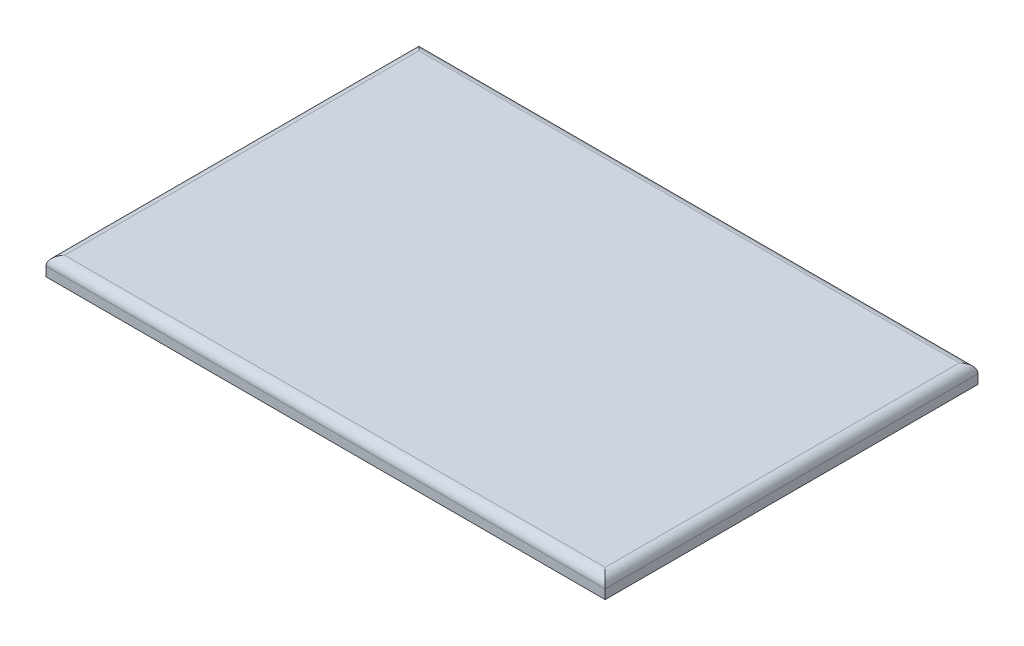
ISO-10303-21;
HEADER;
FILE_DESCRIPTION(('STEP AP214'),'2;1');
FILE_NAME('part.step','',(''),(''),'','','');
FILE_SCHEMA(('AUTOMOTIVE_DESIGN { 1 0 10303 214 1 1 1 1 }'));
ENDSEC;
DATA;
#1=APPLICATION_CONTEXT('core data for automotive mechanical design processes');
#2=APPLICATION_PROTOCOL_DEFINITION('international standard','automotive_design',2000,#1);
#3=PRODUCT_CONTEXT('',#1,'mechanical');
#4=PRODUCT('Part','Part','',(#3));
#5=PRODUCT_RELATED_PRODUCT_CATEGORY('part','',(#4));
#6=PRODUCT_DEFINITION_FORMATION('','',#4);
#7=PRODUCT_DEFINITION_CONTEXT('part definition',#1,'design');
#8=PRODUCT_DEFINITION('design','',#6,#7);
#9=PRODUCT_DEFINITION_SHAPE('','',#8);
#10=(LENGTH_UNIT() NAMED_UNIT(*) SI_UNIT(.MILLI.,.METRE.));
#11=(NAMED_UNIT(*) PLANE_ANGLE_UNIT() SI_UNIT($,.RADIAN.));
#12=(NAMED_UNIT(*) SI_UNIT($,.STERADIAN.) SOLID_ANGLE_UNIT());
#13=UNCERTAINTY_MEASURE_WITH_UNIT(LENGTH_MEASURE(1.E-05),#10,'distance_accuracy_value','');
#14=(GEOMETRIC_REPRESENTATION_CONTEXT(3) GLOBAL_UNCERTAINTY_ASSIGNED_CONTEXT((#13)) GLOBAL_UNIT_ASSIGNED_CONTEXT((#10,
#11,#12)) REPRESENTATION_CONTEXT('',''));
#15=CARTESIAN_POINT('',(0.,0.,0.));
#16=DIRECTION('',(0.,0.,1.));
#17=DIRECTION('',(1.,0.,0.));
#18=AXIS2_PLACEMENT_3D('',#15,#16,#17);
#19=CARTESIAN_POINT('',(30.,2.,-20.));
#20=DIRECTION('',(-1.,0.,0.));
#21=DIRECTION('',(0.,0.,1.));
#22=AXIS2_PLACEMENT_3D('',#19,#20,#21);
#23=PLANE('',#22);
#24=DIRECTION('',(0.,-1.,0.));
#25=VECTOR('',#24,1.);
#26=CARTESIAN_POINT('',(30.,2.,-20.));
#27=LINE('',#26,#25);
#28=CARTESIAN_POINT('',(30.,1.,-20.));
#29=VERTEX_POINT('',#28);
#30=CARTESIAN_POINT('',(30.,0.,-20.));
#31=VERTEX_POINT('',#30);
#32=EDGE_CURVE('E207',#29,#31,#27,.T.);
#33=ORIENTED_EDGE('',*,*,#32,.F.);
#34=DIRECTION('',(0.,0.,-1.));
#35=VECTOR('',#34,1.);
#36=CARTESIAN_POINT('',(30.,1.,20.));
#37=LINE('',#36,#35);
#38=CARTESIAN_POINT('',(30.,1.,20.));
#39=VERTEX_POINT('',#38);
#40=EDGE_CURVE('E233',#29,#39,#37,.F.);
#41=ORIENTED_EDGE('',*,*,#40,.T.);
#42=DIRECTION('',(0.,-1.,0.));
#43=VECTOR('',#42,1.);
#44=CARTESIAN_POINT('',(30.,2.,20.));
#45=LINE('',#44,#43);
#46=CARTESIAN_POINT('',(30.,0.,20.));
#47=VERTEX_POINT('',#46);
#48=EDGE_CURVE('E198',#39,#47,#45,.T.);
#49=ORIENTED_EDGE('',*,*,#48,.T.);
#50=DIRECTION('',(0.,0.,-1.));
#51=VECTOR('',#50,1.);
#52=CARTESIAN_POINT('',(30.,0.,-20.));
#53=LINE('',#52,#51);
#54=EDGE_CURVE('E177',#47,#31,#53,.T.);
#55=ORIENTED_EDGE('',*,*,#54,.T.);
#56=EDGE_LOOP('',(#33,#41,#49,#55));
#57=FACE_BOUND('',#56,.T.);
#58=ADVANCED_FACE('F45',(#57),#23,.F.);
#59=CARTESIAN_POINT('',(-30.,2.,-20.));
#60=DIRECTION('',(0.,0.,1.));
#61=DIRECTION('',(1.,0.,0.));
#62=AXIS2_PLACEMENT_3D('',#59,#60,#61);
#63=PLANE('',#62);
#64=DIRECTION('',(0.,-1.,0.));
#65=VECTOR('',#64,1.);
#66=CARTESIAN_POINT('',(-30.,2.,-20.));
#67=LINE('',#66,#65);
#68=CARTESIAN_POINT('',(-30.,1.,-20.));
#69=VERTEX_POINT('',#68);
#70=CARTESIAN_POINT('',(-30.,0.,-20.));
#71=VERTEX_POINT('',#70);
#72=EDGE_CURVE('E204',#69,#71,#67,.T.);
#73=ORIENTED_EDGE('',*,*,#72,.F.);
#74=DIRECTION('',(-1.,0.,0.));
#75=VECTOR('',#74,1.);
#76=CARTESIAN_POINT('',(30.,1.,-20.));
#77=LINE('',#76,#75);
#78=EDGE_CURVE('E230',#69,#29,#77,.F.);
#79=ORIENTED_EDGE('',*,*,#78,.T.);
#80=ORIENTED_EDGE('',*,*,#32,.T.);
#81=DIRECTION('',(-1.,0.,0.));
#82=VECTOR('',#81,1.);
#83=CARTESIAN_POINT('',(-30.,0.,-20.));
#84=LINE('',#83,#82);
#85=EDGE_CURVE('E186',#31,#71,#84,.T.);
#86=ORIENTED_EDGE('',*,*,#85,.T.);
#87=EDGE_LOOP('',(#73,#79,#80,#86));
#88=FACE_BOUND('',#87,.T.);
#89=ADVANCED_FACE('F304',(#88),#63,.F.);
#90=CARTESIAN_POINT('',(-30.,2.,-20.));
#91=DIRECTION('',(1.,0.,0.));
#92=DIRECTION('',(0.,0.,-1.));
#93=AXIS2_PLACEMENT_3D('',#90,#91,#92);
#94=PLANE('',#93);
#95=DIRECTION('',(0.,-1.,0.));
#96=VECTOR('',#95,1.);
#97=CARTESIAN_POINT('',(-30.,2.,20.));
#98=LINE('',#97,#96);
#99=CARTESIAN_POINT('',(-30.,1.,20.));
#100=VERTEX_POINT('',#99);
#101=CARTESIAN_POINT('',(-30.,0.,20.));
#102=VERTEX_POINT('',#101);
#103=EDGE_CURVE('E201',#100,#102,#98,.T.);
#104=ORIENTED_EDGE('',*,*,#103,.F.);
#105=DIRECTION('',(0.,0.,1.));
#106=VECTOR('',#105,1.);
#107=CARTESIAN_POINT('',(-30.,1.,-20.));
#108=LINE('',#107,#106);
#109=EDGE_CURVE('E227',#100,#69,#108,.F.);
#110=ORIENTED_EDGE('',*,*,#109,.T.);
#111=ORIENTED_EDGE('',*,*,#72,.T.);
#112=DIRECTION('',(0.,0.,1.));
#113=VECTOR('',#112,1.);
#114=CARTESIAN_POINT('',(-30.,0.,-20.));
#115=LINE('',#114,#113);
#116=EDGE_CURVE('E190',#71,#102,#115,.T.);
#117=ORIENTED_EDGE('',*,*,#116,.T.);
#118=EDGE_LOOP('',(#104,#110,#111,#117));
#119=FACE_BOUND('',#118,.T.);
#120=ADVANCED_FACE('F311',(#119),#94,.F.);
#121=CARTESIAN_POINT('',(-30.,2.,20.));
#122=DIRECTION('',(0.,0.,-1.));
#123=DIRECTION('',(-1.,0.,0.));
#124=AXIS2_PLACEMENT_3D('',#121,#122,#123);
#125=PLANE('',#124);
#126=ORIENTED_EDGE('',*,*,#48,.F.);
#127=DIRECTION('',(1.,0.,0.));
#128=VECTOR('',#127,1.);
#129=CARTESIAN_POINT('',(-30.,1.,20.));
#130=LINE('',#129,#128);
#131=EDGE_CURVE('E223',#39,#100,#130,.F.);
#132=ORIENTED_EDGE('',*,*,#131,.T.);
#133=ORIENTED_EDGE('',*,*,#103,.T.);
#134=DIRECTION('',(1.,0.,0.));
#135=VECTOR('',#134,1.);
#136=CARTESIAN_POINT('',(-30.,0.,20.));
#137=LINE('',#136,#135);
#138=EDGE_CURVE('E194',#102,#47,#137,.T.);
#139=ORIENTED_EDGE('',*,*,#138,.T.);
#140=EDGE_LOOP('',(#126,#132,#133,#139));
#141=FACE_BOUND('',#140,.T.);
#142=ADVANCED_FACE('F390',(#141),#125,.F.);
#143=CARTESIAN_POINT('',(0.,2.,0.));
#144=DIRECTION('',(0.,1.,0.));
#145=DIRECTION('',(0.,0.,1.));
#146=AXIS2_PLACEMENT_3D('',#143,#144,#145);
#147=PLANE('',#146);
#148=DIRECTION('',(0.,0.,1.));
#149=VECTOR('',#148,1.);
#150=CARTESIAN_POINT('',(-29.,2.,20.));
#151=LINE('',#150,#149);
#152=CARTESIAN_POINT('',(-29.,2.,-19.));
#153=VERTEX_POINT('',#152);
#154=CARTESIAN_POINT('',(-29.,2.,19.));
#155=VERTEX_POINT('',#154);
#156=EDGE_CURVE('E216',#153,#155,#151,.T.);
#157=ORIENTED_EDGE('',*,*,#156,.T.);
#158=DIRECTION('',(1.,0.,0.));
#159=VECTOR('',#158,1.);
#160=CARTESIAN_POINT('',(30.,2.,19.));
#161=LINE('',#160,#159);
#162=CARTESIAN_POINT('',(29.,2.,19.));
#163=VERTEX_POINT('',#162);
#164=EDGE_CURVE('E219',#155,#163,#161,.T.);
#165=ORIENTED_EDGE('',*,*,#164,.T.);
#166=DIRECTION('',(0.,0.,-1.));
#167=VECTOR('',#166,1.);
#168=CARTESIAN_POINT('',(29.,2.,-20.));
#169=LINE('',#168,#167);
#170=CARTESIAN_POINT('',(29.,2.,-19.));
#171=VERTEX_POINT('',#170);
#172=EDGE_CURVE('E210',#163,#171,#169,.T.);
#173=ORIENTED_EDGE('',*,*,#172,.T.);
#174=DIRECTION('',(-1.,0.,0.));
#175=VECTOR('',#174,1.);
#176=CARTESIAN_POINT('',(-30.,2.,-19.));
#177=LINE('',#176,#175);
#178=EDGE_CURVE('E213',#171,#153,#177,.T.);
#179=ORIENTED_EDGE('',*,*,#178,.T.);
#180=EDGE_LOOP('',(#157,#165,#173,#179));
#181=FACE_BOUND('',#180,.T.);
#182=ADVANCED_FACE('F381',(#181),#147,.T.);
#183=CARTESIAN_POINT('',(0.,0.,0.));
#184=DIRECTION('',(0.,1.,0.));
#185=DIRECTION('',(0.,0.,1.));
#186=AXIS2_PLACEMENT_3D('',#183,#184,#185);
#187=PLANE('',#186);
#188=DIRECTION('',(1.,0.,0.));
#189=VECTOR('',#188,1.);
#190=CARTESIAN_POINT('',(-28.5,0.,18.5));
#191=LINE('',#190,#189);
#192=CARTESIAN_POINT('',(-28.5,0.,18.5));
#193=VERTEX_POINT('',#192);
#194=CARTESIAN_POINT('',(28.5,0.,18.5));
#195=VERTEX_POINT('',#194);
#196=EDGE_CURVE('E148',#193,#195,#191,.T.);
#197=ORIENTED_EDGE('',*,*,#196,.T.);
#198=DIRECTION('',(0.,0.,-1.));
#199=VECTOR('',#198,1.);
#200=CARTESIAN_POINT('',(28.5,0.,-18.5));
#201=LINE('',#200,#199);
#202=CARTESIAN_POINT('',(28.5,0.,-18.5));
#203=VERTEX_POINT('',#202);
#204=EDGE_CURVE('E140',#195,#203,#201,.T.);
#205=ORIENTED_EDGE('',*,*,#204,.T.);
#206=DIRECTION('',(-1.,0.,0.));
#207=VECTOR('',#206,1.);
#208=CARTESIAN_POINT('',(-28.5,0.,-18.5));
#209=LINE('',#208,#207);
#210=CARTESIAN_POINT('',(-28.5,0.,-18.5));
#211=VERTEX_POINT('',#210);
#212=EDGE_CURVE('E151',#203,#211,#209,.T.);
#213=ORIENTED_EDGE('',*,*,#212,.T.);
#214=DIRECTION('',(0.,0.,1.));
#215=VECTOR('',#214,1.);
#216=CARTESIAN_POINT('',(-28.5,0.,-18.5));
#217=LINE('',#216,#215);
#218=EDGE_CURVE('E157',#211,#193,#217,.T.);
#219=ORIENTED_EDGE('',*,*,#218,.T.);
#220=EDGE_LOOP('',(#197,#205,#213,#219));
#221=FACE_BOUND('',#220,.T.);
#222=ORIENTED_EDGE('',*,*,#54,.F.);
#223=ORIENTED_EDGE('',*,*,#138,.F.);
#224=ORIENTED_EDGE('',*,*,#116,.F.);
#225=ORIENTED_EDGE('',*,*,#85,.F.);
#226=EDGE_LOOP('',(#222,#223,#224,#225));
#227=FACE_BOUND('',#226,.T.);
#228=ADVANCED_FACE('F159',(#221,#227),#187,.F.);
#229=CARTESIAN_POINT('',(28.5,-2.,-18.5));
#230=DIRECTION('',(1.,0.,0.));
#231=DIRECTION('',(0.,0.,-1.));
#232=AXIS2_PLACEMENT_3D('',#229,#230,#231);
#233=PLANE('',#232);
#234=DIRECTION('',(0.,1.,0.));
#235=VECTOR('',#234,1.);
#236=CARTESIAN_POINT('',(28.5,-2.,18.5));
#237=LINE('',#236,#235);
#238=CARTESIAN_POINT('',(28.5,-1.,18.5));
#239=VERTEX_POINT('',#238);
#240=EDGE_CURVE('E174',#239,#195,#237,.T.);
#241=ORIENTED_EDGE('',*,*,#240,.F.);
#242=DIRECTION('',(0.,0.,-1.));
#243=VECTOR('',#242,1.);
#244=CARTESIAN_POINT('',(28.5,-1.,-18.5));
#245=LINE('',#244,#243);
#246=CARTESIAN_POINT('',(28.5,-1.,-18.5));
#247=VERTEX_POINT('',#246);
#248=EDGE_CURVE('E11',#239,#247,#245,.T.);
#249=ORIENTED_EDGE('',*,*,#248,.T.);
#250=DIRECTION('',(0.,1.,0.));
#251=VECTOR('',#250,1.);
#252=CARTESIAN_POINT('',(28.5,-2.,-18.5));
#253=LINE('',#252,#251);
#254=EDGE_CURVE('E136',#247,#203,#253,.T.);
#255=ORIENTED_EDGE('',*,*,#254,.T.);
#256=ORIENTED_EDGE('',*,*,#204,.F.);
#257=EDGE_LOOP('',(#241,#249,#255,#256));
#258=FACE_BOUND('',#257,.T.);
#259=ADVANCED_FACE('F138',(#258),#233,.T.);
#260=CARTESIAN_POINT('',(-28.5,-2.,18.5));
#261=DIRECTION('',(0.,0.,1.));
#262=DIRECTION('',(1.,0.,0.));
#263=AXIS2_PLACEMENT_3D('',#260,#261,#262);
#264=PLANE('',#263);
#265=DIRECTION('',(0.,1.,0.));
#266=VECTOR('',#265,1.);
#267=CARTESIAN_POINT('',(-28.5,-2.,18.5));
#268=LINE('',#267,#266);
#269=CARTESIAN_POINT('',(-28.5,-1.,18.5));
#270=VERTEX_POINT('',#269);
#271=EDGE_CURVE('E178',#270,#193,#268,.T.);
#272=ORIENTED_EDGE('',*,*,#271,.F.);
#273=DIRECTION('',(1.,0.,0.));
#274=VECTOR('',#273,1.);
#275=CARTESIAN_POINT('',(28.5,-1.,18.5));
#276=LINE('',#275,#274);
#277=EDGE_CURVE('E55',#270,#239,#276,.T.);
#278=ORIENTED_EDGE('',*,*,#277,.T.);
#279=ORIENTED_EDGE('',*,*,#240,.T.);
#280=ORIENTED_EDGE('',*,*,#196,.F.);
#281=EDGE_LOOP('',(#272,#278,#279,#280));
#282=FACE_BOUND('',#281,.T.);
#283=ADVANCED_FACE('F293',(#282),#264,.T.);
#284=CARTESIAN_POINT('',(-28.5,-2.,-18.5));
#285=DIRECTION('',(-1.,0.,0.));
#286=DIRECTION('',(0.,0.,1.));
#287=AXIS2_PLACEMENT_3D('',#284,#285,#286);
#288=PLANE('',#287);
#289=DIRECTION('',(0.,1.,0.));
#290=VECTOR('',#289,1.);
#291=CARTESIAN_POINT('',(-28.5,-2.,-18.5));
#292=LINE('',#291,#290);
#293=CARTESIAN_POINT('',(-28.5,-1.,-18.5));
#294=VERTEX_POINT('',#293);
#295=EDGE_CURVE('E147',#294,#211,#292,.T.);
#296=ORIENTED_EDGE('',*,*,#295,.F.);
#297=DIRECTION('',(0.,0.,1.));
#298=VECTOR('',#297,1.);
#299=CARTESIAN_POINT('',(-28.5,-1.,18.5));
#300=LINE('',#299,#298);
#301=EDGE_CURVE('E70',#294,#270,#300,.T.);
#302=ORIENTED_EDGE('',*,*,#301,.T.);
#303=ORIENTED_EDGE('',*,*,#271,.T.);
#304=ORIENTED_EDGE('',*,*,#218,.F.);
#305=EDGE_LOOP('',(#296,#302,#303,#304));
#306=FACE_BOUND('',#305,.T.);
#307=ADVANCED_FACE('F292',(#306),#288,.T.);
#308=CARTESIAN_POINT('',(-28.5,-2.,-18.5));
#309=DIRECTION('',(0.,0.,-1.));
#310=DIRECTION('',(-1.,0.,0.));
#311=AXIS2_PLACEMENT_3D('',#308,#309,#310);
#312=PLANE('',#311);
#313=ORIENTED_EDGE('',*,*,#254,.F.);
#314=DIRECTION('',(-1.,0.,0.));
#315=VECTOR('',#314,1.);
#316=CARTESIAN_POINT('',(-28.5,-1.,-18.5));
#317=LINE('',#316,#315);
#318=EDGE_CURVE('E236',#247,#294,#317,.T.);
#319=ORIENTED_EDGE('',*,*,#318,.T.);
#320=ORIENTED_EDGE('',*,*,#295,.T.);
#321=ORIENTED_EDGE('',*,*,#212,.F.);
#322=EDGE_LOOP('',(#313,#319,#320,#321));
#323=FACE_BOUND('',#322,.T.);
#324=ADVANCED_FACE('F152',(#323),#312,.T.);
#325=CARTESIAN_POINT('',(0.,-2.,0.));
#326=DIRECTION('',(0.,1.,0.));
#327=DIRECTION('',(0.,0.,1.));
#328=AXIS2_PLACEMENT_3D('',#325,#326,#327);
#329=PLANE('',#328);
#330=DIRECTION('',(0.,0.,1.));
#331=VECTOR('',#330,1.);
#332=CARTESIAN_POINT('',(-27.5,-2.,-18.5));
#333=LINE('',#332,#331);
#334=CARTESIAN_POINT('',(-27.5,-2.,17.5));
#335=VERTEX_POINT('',#334);
#336=CARTESIAN_POINT('',(-27.5,-2.,-17.5));
#337=VERTEX_POINT('',#336);
#338=EDGE_CURVE('E254',#335,#337,#333,.F.);
#339=ORIENTED_EDGE('',*,*,#338,.T.);
#340=DIRECTION('',(-1.,0.,0.));
#341=VECTOR('',#340,1.);
#342=CARTESIAN_POINT('',(28.5,-2.,-17.5));
#343=LINE('',#342,#341);
#344=CARTESIAN_POINT('',(27.5,-2.,-17.5));
#345=VERTEX_POINT('',#344);
#346=EDGE_CURVE('E257',#337,#345,#343,.F.);
#347=ORIENTED_EDGE('',*,*,#346,.T.);
#348=DIRECTION('',(0.,0.,-1.));
#349=VECTOR('',#348,1.);
#350=CARTESIAN_POINT('',(27.5,-2.,18.5));
#351=LINE('',#350,#349);
#352=CARTESIAN_POINT('',(27.5,-2.,17.5));
#353=VERTEX_POINT('',#352);
#354=EDGE_CURVE('E248',#345,#353,#351,.F.);
#355=ORIENTED_EDGE('',*,*,#354,.T.);
#356=DIRECTION('',(1.,0.,0.));
#357=VECTOR('',#356,1.);
#358=CARTESIAN_POINT('',(-28.5,-2.,17.5));
#359=LINE('',#358,#357);
#360=EDGE_CURVE('E251',#353,#335,#359,.F.);
#361=ORIENTED_EDGE('',*,*,#360,.T.);
#362=EDGE_LOOP('',(#339,#347,#355,#361));
#363=FACE_BOUND('',#362,.T.);
#364=ADVANCED_FACE('F285',(#363),#329,.F.);
#365=CARTESIAN_POINT('',(0.,1.,-19.));
#366=DIRECTION('',(1.,0.,0.));
#367=DIRECTION('',(0.,0.,-1.));
#368=AXIS2_PLACEMENT_3D('',#365,#366,#367);
#369=CYLINDRICAL_SURFACE('',#368,1.);
#370=CARTESIAN_POINT('',(29.,1.,-19.));
#371=DIRECTION('',(0.707106781186548,0.,0.707106781186547));
#372=DIRECTION('',(-0.707106781186547,0.,0.707106781186548));
#373=AXIS2_PLACEMENT_3D('',#370,#371,#372);
#374=ELLIPSE('',#373,1.41421356237309,1.);
#375=EDGE_CURVE('E167',#29,#171,#374,.T.);
#376=ORIENTED_EDGE('',*,*,#375,.F.);
#377=ORIENTED_EDGE('',*,*,#78,.F.);
#378=CARTESIAN_POINT('',(-29.,1.,-19.));
#379=DIRECTION('',(0.707106781186547,0.,-0.707106781186548));
#380=DIRECTION('',(0.707106781186548,0.,0.707106781186547));
#381=AXIS2_PLACEMENT_3D('',#378,#379,#380);
#382=ELLIPSE('',#381,1.4142135623731,1.);
#383=EDGE_CURVE('E163',#153,#69,#382,.F.);
#384=ORIENTED_EDGE('',*,*,#383,.F.);
#385=ORIENTED_EDGE('',*,*,#178,.F.);
#386=EDGE_LOOP('',(#376,#377,#384,#385));
#387=FACE_BOUND('',#386,.T.);
#388=ADVANCED_FACE('F328',(#387),#369,.T.);
#389=CARTESIAN_POINT('',(-29.,1.,0.));
#390=DIRECTION('',(0.,0.,-1.));
#391=DIRECTION('',(-1.,0.,0.));
#392=AXIS2_PLACEMENT_3D('',#389,#390,#391);
#393=CYLINDRICAL_SURFACE('',#392,1.);
#394=ORIENTED_EDGE('',*,*,#383,.T.);
#395=ORIENTED_EDGE('',*,*,#109,.F.);
#396=CARTESIAN_POINT('',(-29.,1.,19.));
#397=DIRECTION('',(-0.707106781186548,0.,-0.707106781186547));
#398=DIRECTION('',(0.707106781186547,0.,-0.707106781186548));
#399=AXIS2_PLACEMENT_3D('',#396,#397,#398);
#400=ELLIPSE('',#399,1.41421356237309,1.);
#401=EDGE_CURVE('E240',#155,#100,#400,.F.);
#402=ORIENTED_EDGE('',*,*,#401,.F.);
#403=ORIENTED_EDGE('',*,*,#156,.F.);
#404=EDGE_LOOP('',(#394,#395,#402,#403));
#405=FACE_BOUND('',#404,.T.);
#406=ADVANCED_FACE('F324',(#405),#393,.T.);
#407=CARTESIAN_POINT('',(29.,1.,0.));
#408=DIRECTION('',(0.,0.,1.));
#409=DIRECTION('',(1.,0.,0.));
#410=AXIS2_PLACEMENT_3D('',#407,#408,#409);
#411=CYLINDRICAL_SURFACE('',#410,1.);
#412=ORIENTED_EDGE('',*,*,#375,.T.);
#413=ORIENTED_EDGE('',*,*,#172,.F.);
#414=CARTESIAN_POINT('',(29.,1.,19.));
#415=DIRECTION('',(-0.707106781186547,0.,0.707106781186548));
#416=DIRECTION('',(0.707106781186548,0.,0.707106781186547));
#417=AXIS2_PLACEMENT_3D('',#414,#415,#416);
#418=ELLIPSE('',#417,1.4142135623731,1.);
#419=EDGE_CURVE('E237',#39,#163,#418,.T.);
#420=ORIENTED_EDGE('',*,*,#419,.F.);
#421=ORIENTED_EDGE('',*,*,#40,.F.);
#422=EDGE_LOOP('',(#412,#413,#420,#421));
#423=FACE_BOUND('',#422,.T.);
#424=ADVANCED_FACE('F320',(#423),#411,.T.);
#425=CARTESIAN_POINT('',(0.,1.,19.));
#426=DIRECTION('',(-1.,0.,0.));
#427=DIRECTION('',(0.,0.,1.));
#428=AXIS2_PLACEMENT_3D('',#425,#426,#427);
#429=CYLINDRICAL_SURFACE('',#428,1.);
#430=ORIENTED_EDGE('',*,*,#401,.T.);
#431=ORIENTED_EDGE('',*,*,#131,.F.);
#432=ORIENTED_EDGE('',*,*,#419,.T.);
#433=ORIENTED_EDGE('',*,*,#164,.F.);
#434=EDGE_LOOP('',(#430,#431,#432,#433));
#435=FACE_BOUND('',#434,.T.);
#436=ADVANCED_FACE('F317',(#435),#429,.T.);
#437=CARTESIAN_POINT('',(-28.5,-1.,17.5));
#438=DIRECTION('',(-1.,0.,0.));
#439=DIRECTION('',(0.,0.,1.));
#440=AXIS2_PLACEMENT_3D('',#437,#438,#439);
#441=CYLINDRICAL_SURFACE('',#440,1.);
#442=CARTESIAN_POINT('',(-27.5,-1.,17.5));
#443=DIRECTION('',(-0.707106781186547,0.,-0.707106781186547));
#444=DIRECTION('',(-0.707106781186547,0.,0.707106781186548));
#445=AXIS2_PLACEMENT_3D('',#442,#443,#444);
#446=ELLIPSE('',#445,1.41421356237309,1.);
#447=EDGE_CURVE('E270',#335,#270,#446,.T.);
#448=ORIENTED_EDGE('',*,*,#447,.F.);
#449=ORIENTED_EDGE('',*,*,#360,.F.);
#450=CARTESIAN_POINT('',(27.5,-1.,17.5));
#451=DIRECTION('',(-0.707106781186547,0.,0.707106781186548));
#452=DIRECTION('',(0.707106781186547,0.,0.707106781186547));
#453=AXIS2_PLACEMENT_3D('',#450,#451,#452);
#454=ELLIPSE('',#453,1.4142135623731,1.);
#455=EDGE_CURVE('E49',#239,#353,#454,.F.);
#456=ORIENTED_EDGE('',*,*,#455,.F.);
#457=ORIENTED_EDGE('',*,*,#277,.F.);
#458=EDGE_LOOP('',(#448,#449,#456,#457));
#459=FACE_BOUND('',#458,.T.);
#460=ADVANCED_FACE('F47',(#459),#441,.T.);
#461=CARTESIAN_POINT('',(27.5,-1.,-18.5));
#462=DIRECTION('',(0.,0.,1.));
#463=DIRECTION('',(1.,0.,0.));
#464=AXIS2_PLACEMENT_3D('',#461,#462,#463);
#465=CYLINDRICAL_SURFACE('',#464,1.);
#466=ORIENTED_EDGE('',*,*,#455,.T.);
#467=ORIENTED_EDGE('',*,*,#354,.F.);
#468=CARTESIAN_POINT('',(27.5,-1.,-17.5));
#469=DIRECTION('',(0.707106781186547,0.,0.707106781186547));
#470=DIRECTION('',(-0.707106781186547,0.,0.707106781186548));
#471=AXIS2_PLACEMENT_3D('',#468,#469,#470);
#472=ELLIPSE('',#471,1.41421356237309,1.);
#473=EDGE_CURVE('E268',#247,#345,#472,.F.);
#474=ORIENTED_EDGE('',*,*,#473,.F.);
#475=ORIENTED_EDGE('',*,*,#248,.F.);
#476=EDGE_LOOP('',(#466,#467,#474,#475));
#477=FACE_BOUND('',#476,.T.);
#478=ADVANCED_FACE('F281',(#477),#465,.T.);
#479=CARTESIAN_POINT('',(-27.5,-1.,-18.5));
#480=DIRECTION('',(0.,0.,-1.));
#481=DIRECTION('',(-1.,0.,0.));
#482=AXIS2_PLACEMENT_3D('',#479,#480,#481);
#483=CYLINDRICAL_SURFACE('',#482,1.);
#484=ORIENTED_EDGE('',*,*,#447,.T.);
#485=ORIENTED_EDGE('',*,*,#301,.F.);
#486=CARTESIAN_POINT('',(-27.5,-1.,-17.5));
#487=DIRECTION('',(0.707106781186547,0.,-0.707106781186548));
#488=DIRECTION('',(-0.707106781186547,0.,-0.707106781186547));
#489=AXIS2_PLACEMENT_3D('',#486,#487,#488);
#490=ELLIPSE('',#489,1.4142135623731,1.);
#491=EDGE_CURVE('E265',#337,#294,#490,.T.);
#492=ORIENTED_EDGE('',*,*,#491,.F.);
#493=ORIENTED_EDGE('',*,*,#338,.F.);
#494=EDGE_LOOP('',(#484,#485,#492,#493));
#495=FACE_BOUND('',#494,.T.);
#496=ADVANCED_FACE('F291',(#495),#483,.T.);
#497=CARTESIAN_POINT('',(-28.5,-1.,-17.5));
#498=DIRECTION('',(1.,0.,0.));
#499=DIRECTION('',(0.,0.,-1.));
#500=AXIS2_PLACEMENT_3D('',#497,#498,#499);
#501=CYLINDRICAL_SURFACE('',#500,1.);
#502=ORIENTED_EDGE('',*,*,#473,.T.);
#503=ORIENTED_EDGE('',*,*,#346,.F.);
#504=ORIENTED_EDGE('',*,*,#491,.T.);
#505=ORIENTED_EDGE('',*,*,#318,.F.);
#506=EDGE_LOOP('',(#502,#503,#504,#505));
#507=FACE_BOUND('',#506,.T.);
#508=ADVANCED_FACE('F289',(#507),#501,.T.);
#509=CLOSED_SHELL('',(#58,#89,#120,#142,#182,#228,#259,#283,#307,#324,#364,#388,#406,#424,#436,
#460,#478,#496,#508));
#510=MANIFOLD_SOLID_BREP('B2',#509);
#511=ADVANCED_BREP_SHAPE_REPRESENTATION('',(#18,#510),#14);
#512=SHAPE_DEFINITION_REPRESENTATION(#9,#511);
ENDSEC;
END-ISO-10303-21;
